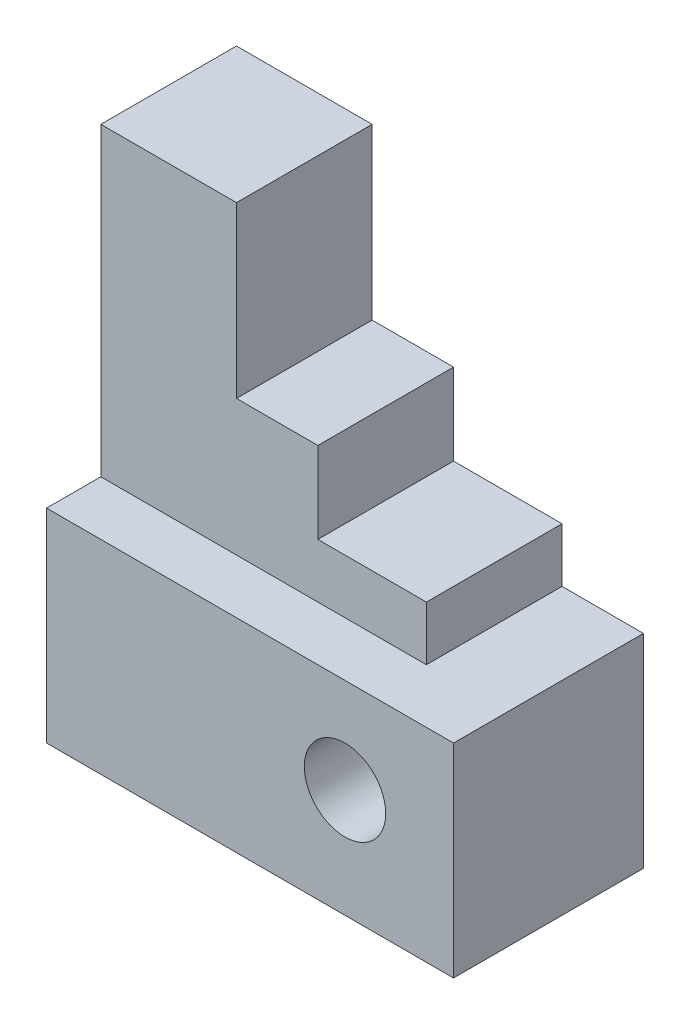
ISO-10303-21;
HEADER;
FILE_DESCRIPTION(('STEP AP214'),'2;1');
FILE_NAME('part.step','',(''),(''),'','','');
FILE_SCHEMA(('AUTOMOTIVE_DESIGN { 1 0 10303 214 1 1 1 1 }'));
ENDSEC;
DATA;
#1=APPLICATION_CONTEXT('core data for automotive mechanical design processes');
#2=APPLICATION_PROTOCOL_DEFINITION('international standard','automotive_design',2000,#1);
#3=PRODUCT_CONTEXT('',#1,'mechanical');
#4=PRODUCT('Part','Part','',(#3));
#5=PRODUCT_RELATED_PRODUCT_CATEGORY('part','',(#4));
#6=PRODUCT_DEFINITION_FORMATION('','',#4);
#7=PRODUCT_DEFINITION_CONTEXT('part definition',#1,'design');
#8=PRODUCT_DEFINITION('design','',#6,#7);
#9=PRODUCT_DEFINITION_SHAPE('','',#8);
#10=(LENGTH_UNIT() NAMED_UNIT(*) SI_UNIT(.MILLI.,.METRE.));
#11=(NAMED_UNIT(*) PLANE_ANGLE_UNIT() SI_UNIT($,.RADIAN.));
#12=(NAMED_UNIT(*) SI_UNIT($,.STERADIAN.) SOLID_ANGLE_UNIT());
#13=UNCERTAINTY_MEASURE_WITH_UNIT(LENGTH_MEASURE(1.E-05),#10,'distance_accuracy_value','');
#14=(GEOMETRIC_REPRESENTATION_CONTEXT(3) GLOBAL_UNCERTAINTY_ASSIGNED_CONTEXT((#13)) GLOBAL_UNIT_ASSIGNED_CONTEXT((#10,
#11,#12)) REPRESENTATION_CONTEXT('',''));
#15=CARTESIAN_POINT('',(0.,0.,0.));
#16=DIRECTION('',(0.,0.,1.));
#17=DIRECTION('',(1.,0.,0.));
#18=AXIS2_PLACEMENT_3D('',#15,#16,#17);
#19=CARTESIAN_POINT('',(0.,30.,0.));
#20=DIRECTION('',(1.,0.,0.));
#21=DIRECTION('',(0.,0.,-1.));
#22=AXIS2_PLACEMENT_3D('',#19,#20,#21);
#23=PLANE('',#22);
#24=DIRECTION('',(0.,0.,1.));
#25=VECTOR('',#24,1.);
#26=CARTESIAN_POINT('',(0.,0.,0.));
#27=LINE('',#26,#25);
#28=CARTESIAN_POINT('',(0.,0.,0.));
#29=VERTEX_POINT('',#28);
#30=CARTESIAN_POINT('',(0.,0.,28.));
#31=VERTEX_POINT('',#30);
#32=EDGE_CURVE('E140',#29,#31,#27,.T.);
#33=ORIENTED_EDGE('',*,*,#32,.T.);
#34=DIRECTION('',(0.,-1.,0.));
#35=VECTOR('',#34,1.);
#36=CARTESIAN_POINT('',(0.,30.,28.));
#37=LINE('',#36,#35);
#38=CARTESIAN_POINT('',(0.,30.,28.));
#39=VERTEX_POINT('',#38);
#40=EDGE_CURVE('E11',#39,#31,#37,.T.);
#41=ORIENTED_EDGE('',*,*,#40,.F.);
#42=DIRECTION('',(0.,0.,1.));
#43=VECTOR('',#42,1.);
#44=CARTESIAN_POINT('',(0.,30.,0.));
#45=LINE('',#44,#43);
#46=CARTESIAN_POINT('',(0.,30.,20.));
#47=VERTEX_POINT('',#46);
#48=EDGE_CURVE('E136',#47,#39,#45,.T.);
#49=ORIENTED_EDGE('',*,*,#48,.F.);
#50=DIRECTION('',(0.,-1.,0.));
#51=VECTOR('',#50,1.);
#52=CARTESIAN_POINT('',(0.,38.,20.));
#53=LINE('',#52,#51);
#54=CARTESIAN_POINT('',(0.,75.,20.));
#55=VERTEX_POINT('',#54);
#56=EDGE_CURVE('E129',#55,#47,#53,.T.);
#57=ORIENTED_EDGE('',*,*,#56,.F.);
#58=DIRECTION('',(0.,0.,1.));
#59=VECTOR('',#58,1.);
#60=CARTESIAN_POINT('',(0.,75.,0.));
#61=LINE('',#60,#59);
#62=CARTESIAN_POINT('',(0.,75.,0.));
#63=VERTEX_POINT('',#62);
#64=EDGE_CURVE('E134',#63,#55,#61,.T.);
#65=ORIENTED_EDGE('',*,*,#64,.F.);
#66=DIRECTION('',(0.,-1.,0.));
#67=VECTOR('',#66,1.);
#68=CARTESIAN_POINT('',(0.,30.,0.));
#69=LINE('',#68,#67);
#70=EDGE_CURVE('E230',#63,#29,#69,.T.);
#71=ORIENTED_EDGE('',*,*,#70,.T.);
#72=EDGE_LOOP('',(#33,#41,#49,#57,#65,#71));
#73=FACE_BOUND('',#72,.T.);
#74=ADVANCED_FACE('F45',(#73),#23,.F.);
#75=CARTESIAN_POINT('',(0.,30.,28.));
#76=DIRECTION('',(0.,0.,-1.));
#77=DIRECTION('',(-1.,0.,0.));
#78=AXIS2_PLACEMENT_3D('',#75,#76,#77);
#79=PLANE('',#78);
#80=CARTESIAN_POINT('',(44.,16.,28.));
#81=DIRECTION('',(0.,0.,1.));
#82=DIRECTION('',(1.,0.,0.));
#83=AXIS2_PLACEMENT_3D('',#80,#81,#82);
#84=CIRCLE('',#83,5.99999999999999);
#85=CARTESIAN_POINT('',(50.,16.,28.));
#86=VERTEX_POINT('',#85);
#87=EDGE_CURVE('E163',#86,#86,#84,.T.);
#88=ORIENTED_EDGE('',*,*,#87,.F.);
#89=EDGE_LOOP('',(#88));
#90=FACE_BOUND('',#89,.T.);
#91=DIRECTION('',(1.,0.,0.));
#92=VECTOR('',#91,1.);
#93=CARTESIAN_POINT('',(0.,0.,28.));
#94=LINE('',#93,#92);
#95=CARTESIAN_POINT('',(60.,0.,28.));
#96=VERTEX_POINT('',#95);
#97=EDGE_CURVE('E233',#31,#96,#94,.T.);
#98=ORIENTED_EDGE('',*,*,#97,.T.);
#99=DIRECTION('',(0.,-1.,0.));
#100=VECTOR('',#99,1.);
#101=CARTESIAN_POINT('',(60.,30.,28.));
#102=LINE('',#101,#100);
#103=CARTESIAN_POINT('',(60.,30.,28.));
#104=VERTEX_POINT('',#103);
#105=EDGE_CURVE('E53',#104,#96,#102,.T.);
#106=ORIENTED_EDGE('',*,*,#105,.F.);
#107=DIRECTION('',(1.,0.,0.));
#108=VECTOR('',#107,1.);
#109=CARTESIAN_POINT('',(0.,30.,28.));
#110=LINE('',#109,#108);
#111=EDGE_CURVE('E220',#39,#104,#110,.T.);
#112=ORIENTED_EDGE('',*,*,#111,.F.);
#113=ORIENTED_EDGE('',*,*,#40,.T.);
#114=EDGE_LOOP('',(#98,#106,#112,#113));
#115=FACE_BOUND('',#114,.T.);
#116=ADVANCED_FACE('F263',(#90,#115),#79,.F.);
#117=CARTESIAN_POINT('',(60.,30.,0.));
#118=DIRECTION('',(-1.,0.,0.));
#119=DIRECTION('',(0.,0.,1.));
#120=AXIS2_PLACEMENT_3D('',#117,#118,#119);
#121=PLANE('',#120);
#122=DIRECTION('',(0.,0.,-1.));
#123=VECTOR('',#122,1.);
#124=CARTESIAN_POINT('',(60.,0.,0.));
#125=LINE('',#124,#123);
#126=CARTESIAN_POINT('',(60.,0.,0.));
#127=VERTEX_POINT('',#126);
#128=EDGE_CURVE('E236',#96,#127,#125,.T.);
#129=ORIENTED_EDGE('',*,*,#128,.T.);
#130=DIRECTION('',(0.,-1.,0.));
#131=VECTOR('',#130,1.);
#132=CARTESIAN_POINT('',(60.,30.,0.));
#133=LINE('',#132,#131);
#134=CARTESIAN_POINT('',(60.,30.,0.));
#135=VERTEX_POINT('',#134);
#136=EDGE_CURVE('E243',#135,#127,#133,.T.);
#137=ORIENTED_EDGE('',*,*,#136,.F.);
#138=DIRECTION('',(0.,0.,-1.));
#139=VECTOR('',#138,1.);
#140=CARTESIAN_POINT('',(60.,30.,0.));
#141=LINE('',#140,#139);
#142=EDGE_CURVE('E224',#104,#135,#141,.T.);
#143=ORIENTED_EDGE('',*,*,#142,.F.);
#144=ORIENTED_EDGE('',*,*,#105,.T.);
#145=EDGE_LOOP('',(#129,#137,#143,#144));
#146=FACE_BOUND('',#145,.T.);
#147=ADVANCED_FACE('F252',(#146),#121,.F.);
#148=CARTESIAN_POINT('',(0.,30.,0.));
#149=DIRECTION('',(0.,0.,1.));
#150=DIRECTION('',(1.,0.,0.));
#151=AXIS2_PLACEMENT_3D('',#148,#149,#150);
#152=PLANE('',#151);
#153=CARTESIAN_POINT('',(44.,16.,0.));
#154=DIRECTION('',(0.,0.,1.));
#155=DIRECTION('',(1.,0.,0.));
#156=AXIS2_PLACEMENT_3D('',#153,#154,#155);
#157=CIRCLE('',#156,5.99999999999999);
#158=CARTESIAN_POINT('',(50.,16.,0.));
#159=VERTEX_POINT('',#158);
#160=EDGE_CURVE('E160',#159,#159,#157,.T.);
#161=ORIENTED_EDGE('',*,*,#160,.T.);
#162=EDGE_LOOP('',(#161));
#163=FACE_BOUND('',#162,.T.);
#164=DIRECTION('',(-1.,0.,0.));
#165=VECTOR('',#164,1.);
#166=CARTESIAN_POINT('',(0.,0.,0.));
#167=LINE('',#166,#165);
#168=EDGE_CURVE('E221',#127,#29,#167,.T.);
#169=ORIENTED_EDGE('',*,*,#168,.T.);
#170=ORIENTED_EDGE('',*,*,#70,.F.);
#171=DIRECTION('',(-1.,0.,0.));
#172=VECTOR('',#171,1.);
#173=CARTESIAN_POINT('',(0.,75.,0.));
#174=LINE('',#173,#172);
#175=CARTESIAN_POINT('',(20.,75.,0.));
#176=VERTEX_POINT('',#175);
#177=EDGE_CURVE('E156',#176,#63,#174,.T.);
#178=ORIENTED_EDGE('',*,*,#177,.F.);
#179=DIRECTION('',(0.,-1.,0.));
#180=VECTOR('',#179,1.);
#181=CARTESIAN_POINT('',(20.,75.,0.));
#182=LINE('',#181,#180);
#183=CARTESIAN_POINT('',(20.,50.,0.));
#184=VERTEX_POINT('',#183);
#185=EDGE_CURVE('E169',#176,#184,#182,.T.);
#186=ORIENTED_EDGE('',*,*,#185,.T.);
#187=DIRECTION('',(-1.,0.,0.));
#188=VECTOR('',#187,1.);
#189=CARTESIAN_POINT('',(0.,50.,0.));
#190=LINE('',#189,#188);
#191=CARTESIAN_POINT('',(32.,50.,0.));
#192=VERTEX_POINT('',#191);
#193=EDGE_CURVE('E182',#192,#184,#190,.T.);
#194=ORIENTED_EDGE('',*,*,#193,.F.);
#195=DIRECTION('',(0.,-1.,0.));
#196=VECTOR('',#195,1.);
#197=CARTESIAN_POINT('',(32.,50.,0.));
#198=LINE('',#197,#196);
#199=CARTESIAN_POINT('',(32.,38.,0.));
#200=VERTEX_POINT('',#199);
#201=EDGE_CURVE('E185',#192,#200,#198,.T.);
#202=ORIENTED_EDGE('',*,*,#201,.T.);
#203=DIRECTION('',(-1.,0.,0.));
#204=VECTOR('',#203,1.);
#205=CARTESIAN_POINT('',(0.,38.,0.));
#206=LINE('',#205,#204);
#207=CARTESIAN_POINT('',(48.,38.,0.));
#208=VERTEX_POINT('',#207);
#209=EDGE_CURVE('E203',#208,#200,#206,.T.);
#210=ORIENTED_EDGE('',*,*,#209,.F.);
#211=DIRECTION('',(0.,-1.,0.));
#212=VECTOR('',#211,1.);
#213=CARTESIAN_POINT('',(48.,38.,0.));
#214=LINE('',#213,#212);
#215=CARTESIAN_POINT('',(48.,30.,0.));
#216=VERTEX_POINT('',#215);
#217=EDGE_CURVE('E206',#208,#216,#214,.T.);
#218=ORIENTED_EDGE('',*,*,#217,.T.);
#219=DIRECTION('',(-1.,0.,0.));
#220=VECTOR('',#219,1.);
#221=CARTESIAN_POINT('',(0.,30.,0.));
#222=LINE('',#221,#220);
#223=EDGE_CURVE('E227',#135,#216,#222,.T.);
#224=ORIENTED_EDGE('',*,*,#223,.F.);
#225=ORIENTED_EDGE('',*,*,#136,.T.);
#226=EDGE_LOOP('',(#169,#170,#178,#186,#194,#202,#210,#218,#224,#225));
#227=FACE_BOUND('',#226,.T.);
#228=ADVANCED_FACE('F261',(#163,#227),#152,.F.);
#229=CARTESIAN_POINT('',(0.,30.,0.));
#230=DIRECTION('',(0.,1.,0.));
#231=DIRECTION('',(0.,0.,1.));
#232=AXIS2_PLACEMENT_3D('',#229,#230,#231);
#233=PLANE('',#232);
#234=DIRECTION('',(0.,0.,-1.));
#235=VECTOR('',#234,1.);
#236=CARTESIAN_POINT('',(48.,30.,0.));
#237=LINE('',#236,#235);
#238=CARTESIAN_POINT('',(48.,30.,20.));
#239=VERTEX_POINT('',#238);
#240=EDGE_CURVE('E200',#239,#216,#237,.T.);
#241=ORIENTED_EDGE('',*,*,#240,.F.);
#242=DIRECTION('',(1.,0.,0.));
#243=VECTOR('',#242,1.);
#244=CARTESIAN_POINT('',(0.,30.,20.));
#245=LINE('',#244,#243);
#246=EDGE_CURVE('E195',#47,#239,#245,.T.);
#247=ORIENTED_EDGE('',*,*,#246,.F.);
#248=ORIENTED_EDGE('',*,*,#48,.T.);
#249=ORIENTED_EDGE('',*,*,#111,.T.);
#250=ORIENTED_EDGE('',*,*,#142,.T.);
#251=ORIENTED_EDGE('',*,*,#223,.T.);
#252=EDGE_LOOP('',(#241,#247,#248,#249,#250,#251));
#253=FACE_BOUND('',#252,.T.);
#254=ADVANCED_FACE('F265',(#253),#233,.T.);
#255=CARTESIAN_POINT('',(0.,0.,0.));
#256=DIRECTION('',(0.,1.,0.));
#257=DIRECTION('',(0.,0.,1.));
#258=AXIS2_PLACEMENT_3D('',#255,#256,#257);
#259=PLANE('',#258);
#260=ORIENTED_EDGE('',*,*,#32,.F.);
#261=ORIENTED_EDGE('',*,*,#168,.F.);
#262=ORIENTED_EDGE('',*,*,#128,.F.);
#263=ORIENTED_EDGE('',*,*,#97,.F.);
#264=EDGE_LOOP('',(#260,#261,#262,#263));
#265=FACE_BOUND('',#264,.T.);
#266=ADVANCED_FACE('F259',(#265),#259,.F.);
#267=CARTESIAN_POINT('',(0.,38.,20.));
#268=DIRECTION('',(0.,0.,-1.));
#269=DIRECTION('',(-1.,0.,0.));
#270=AXIS2_PLACEMENT_3D('',#267,#268,#269);
#271=PLANE('',#270);
#272=ORIENTED_EDGE('',*,*,#246,.T.);
#273=DIRECTION('',(0.,-1.,0.));
#274=VECTOR('',#273,1.);
#275=CARTESIAN_POINT('',(48.,38.,20.));
#276=LINE('',#275,#274);
#277=CARTESIAN_POINT('',(48.,38.,20.));
#278=VERTEX_POINT('',#277);
#279=EDGE_CURVE('E141',#278,#239,#276,.T.);
#280=ORIENTED_EDGE('',*,*,#279,.F.);
#281=DIRECTION('',(1.,0.,0.));
#282=VECTOR('',#281,1.);
#283=CARTESIAN_POINT('',(0.,38.,20.));
#284=LINE('',#283,#282);
#285=CARTESIAN_POINT('',(32.,38.,20.));
#286=VERTEX_POINT('',#285);
#287=EDGE_CURVE('E196',#286,#278,#284,.T.);
#288=ORIENTED_EDGE('',*,*,#287,.F.);
#289=DIRECTION('',(0.,-1.,0.));
#290=VECTOR('',#289,1.);
#291=CARTESIAN_POINT('',(32.,50.,20.));
#292=LINE('',#291,#290);
#293=CARTESIAN_POINT('',(32.,50.,20.));
#294=VERTEX_POINT('',#293);
#295=EDGE_CURVE('E191',#294,#286,#292,.T.);
#296=ORIENTED_EDGE('',*,*,#295,.F.);
#297=DIRECTION('',(1.,0.,0.));
#298=VECTOR('',#297,1.);
#299=CARTESIAN_POINT('',(0.,50.,20.));
#300=LINE('',#299,#298);
#301=CARTESIAN_POINT('',(20.,50.,20.));
#302=VERTEX_POINT('',#301);
#303=EDGE_CURVE('E176',#302,#294,#300,.T.);
#304=ORIENTED_EDGE('',*,*,#303,.F.);
#305=DIRECTION('',(0.,-1.,0.));
#306=VECTOR('',#305,1.);
#307=CARTESIAN_POINT('',(20.,75.,20.));
#308=LINE('',#307,#306);
#309=CARTESIAN_POINT('',(20.,75.,20.));
#310=VERTEX_POINT('',#309);
#311=EDGE_CURVE('E147',#310,#302,#308,.T.);
#312=ORIENTED_EDGE('',*,*,#311,.F.);
#313=DIRECTION('',(1.,0.,0.));
#314=VECTOR('',#313,1.);
#315=CARTESIAN_POINT('',(0.,75.,20.));
#316=LINE('',#315,#314);
#317=EDGE_CURVE('E144',#55,#310,#316,.T.);
#318=ORIENTED_EDGE('',*,*,#317,.F.);
#319=ORIENTED_EDGE('',*,*,#56,.T.);
#320=EDGE_LOOP('',(#272,#280,#288,#296,#304,#312,#318,#319));
#321=FACE_BOUND('',#320,.T.);
#322=ADVANCED_FACE('F145',(#321),#271,.F.);
#323=CARTESIAN_POINT('',(48.,38.,0.));
#324=DIRECTION('',(-1.,0.,0.));
#325=DIRECTION('',(0.,0.,1.));
#326=AXIS2_PLACEMENT_3D('',#323,#324,#325);
#327=PLANE('',#326);
#328=ORIENTED_EDGE('',*,*,#240,.T.);
#329=ORIENTED_EDGE('',*,*,#217,.F.);
#330=DIRECTION('',(0.,0.,-1.));
#331=VECTOR('',#330,1.);
#332=CARTESIAN_POINT('',(48.,38.,0.));
#333=LINE('',#332,#331);
#334=EDGE_CURVE('E199',#278,#208,#333,.T.);
#335=ORIENTED_EDGE('',*,*,#334,.F.);
#336=ORIENTED_EDGE('',*,*,#279,.T.);
#337=EDGE_LOOP('',(#328,#329,#335,#336));
#338=FACE_BOUND('',#337,.T.);
#339=ADVANCED_FACE('F269',(#338),#327,.F.);
#340=CARTESIAN_POINT('',(0.,38.,0.));
#341=DIRECTION('',(0.,1.,0.));
#342=DIRECTION('',(0.,0.,1.));
#343=AXIS2_PLACEMENT_3D('',#340,#341,#342);
#344=PLANE('',#343);
#345=DIRECTION('',(0.,0.,-1.));
#346=VECTOR('',#345,1.);
#347=CARTESIAN_POINT('',(32.,38.,0.));
#348=LINE('',#347,#346);
#349=EDGE_CURVE('E68',#286,#200,#348,.T.);
#350=ORIENTED_EDGE('',*,*,#349,.F.);
#351=ORIENTED_EDGE('',*,*,#287,.T.);
#352=ORIENTED_EDGE('',*,*,#334,.T.);
#353=ORIENTED_EDGE('',*,*,#209,.T.);
#354=EDGE_LOOP('',(#350,#351,#352,#353));
#355=FACE_BOUND('',#354,.T.);
#356=ADVANCED_FACE('F272',(#355),#344,.T.);
#357=CARTESIAN_POINT('',(32.,50.,0.));
#358=DIRECTION('',(-1.,0.,0.));
#359=DIRECTION('',(0.,0.,1.));
#360=AXIS2_PLACEMENT_3D('',#357,#358,#359);
#361=PLANE('',#360);
#362=ORIENTED_EDGE('',*,*,#349,.T.);
#363=ORIENTED_EDGE('',*,*,#201,.F.);
#364=DIRECTION('',(0.,0.,-1.));
#365=VECTOR('',#364,1.);
#366=CARTESIAN_POINT('',(32.,50.,0.));
#367=LINE('',#366,#365);
#368=EDGE_CURVE('E179',#294,#192,#367,.T.);
#369=ORIENTED_EDGE('',*,*,#368,.F.);
#370=ORIENTED_EDGE('',*,*,#295,.T.);
#371=EDGE_LOOP('',(#362,#363,#369,#370));
#372=FACE_BOUND('',#371,.T.);
#373=ADVANCED_FACE('F276',(#372),#361,.F.);
#374=CARTESIAN_POINT('',(0.,50.,0.));
#375=DIRECTION('',(0.,1.,0.));
#376=DIRECTION('',(0.,0.,1.));
#377=AXIS2_PLACEMENT_3D('',#374,#375,#376);
#378=PLANE('',#377);
#379=DIRECTION('',(0.,0.,-1.));
#380=VECTOR('',#379,1.);
#381=CARTESIAN_POINT('',(20.,50.,0.));
#382=LINE('',#381,#380);
#383=EDGE_CURVE('E60',#302,#184,#382,.T.);
#384=ORIENTED_EDGE('',*,*,#383,.F.);
#385=ORIENTED_EDGE('',*,*,#303,.T.);
#386=ORIENTED_EDGE('',*,*,#368,.T.);
#387=ORIENTED_EDGE('',*,*,#193,.T.);
#388=EDGE_LOOP('',(#384,#385,#386,#387));
#389=FACE_BOUND('',#388,.T.);
#390=ADVANCED_FACE('F279',(#389),#378,.T.);
#391=CARTESIAN_POINT('',(20.,75.,0.));
#392=DIRECTION('',(-1.,0.,0.));
#393=DIRECTION('',(0.,0.,1.));
#394=AXIS2_PLACEMENT_3D('',#391,#392,#393);
#395=PLANE('',#394);
#396=ORIENTED_EDGE('',*,*,#383,.T.);
#397=ORIENTED_EDGE('',*,*,#185,.F.);
#398=DIRECTION('',(0.,0.,-1.));
#399=VECTOR('',#398,1.);
#400=CARTESIAN_POINT('',(20.,75.,0.));
#401=LINE('',#400,#399);
#402=EDGE_CURVE('E151',#310,#176,#401,.T.);
#403=ORIENTED_EDGE('',*,*,#402,.F.);
#404=ORIENTED_EDGE('',*,*,#311,.T.);
#405=EDGE_LOOP('',(#396,#397,#403,#404));
#406=FACE_BOUND('',#405,.T.);
#407=ADVANCED_FACE('F281',(#406),#395,.F.);
#408=CARTESIAN_POINT('',(0.,75.,0.));
#409=DIRECTION('',(0.,1.,0.));
#410=DIRECTION('',(0.,0.,1.));
#411=AXIS2_PLACEMENT_3D('',#408,#409,#410);
#412=PLANE('',#411);
#413=ORIENTED_EDGE('',*,*,#64,.T.);
#414=ORIENTED_EDGE('',*,*,#317,.T.);
#415=ORIENTED_EDGE('',*,*,#402,.T.);
#416=ORIENTED_EDGE('',*,*,#177,.T.);
#417=EDGE_LOOP('',(#413,#414,#415,#416));
#418=FACE_BOUND('',#417,.T.);
#419=ADVANCED_FACE('F154',(#418),#412,.T.);
#420=CARTESIAN_POINT('',(44.,16.,0.));
#421=DIRECTION('',(0.,0.,1.));
#422=DIRECTION('',(1.,0.,0.));
#423=AXIS2_PLACEMENT_3D('',#420,#421,#422);
#424=CYLINDRICAL_SURFACE('',#423,5.99999999999999);
#425=ORIENTED_EDGE('',*,*,#160,.F.);
#426=EDGE_LOOP('',(#425));
#427=FACE_BOUND('',#426,.T.);
#428=ORIENTED_EDGE('',*,*,#87,.T.);
#429=EDGE_LOOP('',(#428));
#430=FACE_BOUND('',#429,.T.);
#431=ADVANCED_FACE('F289',(#427,#430),#424,.F.);
#432=CLOSED_SHELL('',(#74,#116,#147,#228,#254,#266,#322,#339,#356,#373,#390,#407,#419,#431));
#433=MANIFOLD_SOLID_BREP('B2',#432);
#434=ADVANCED_BREP_SHAPE_REPRESENTATION('',(#18,#433),#14);
#435=SHAPE_DEFINITION_REPRESENTATION(#9,#434);
ENDSEC;
END-ISO-10303-21;
